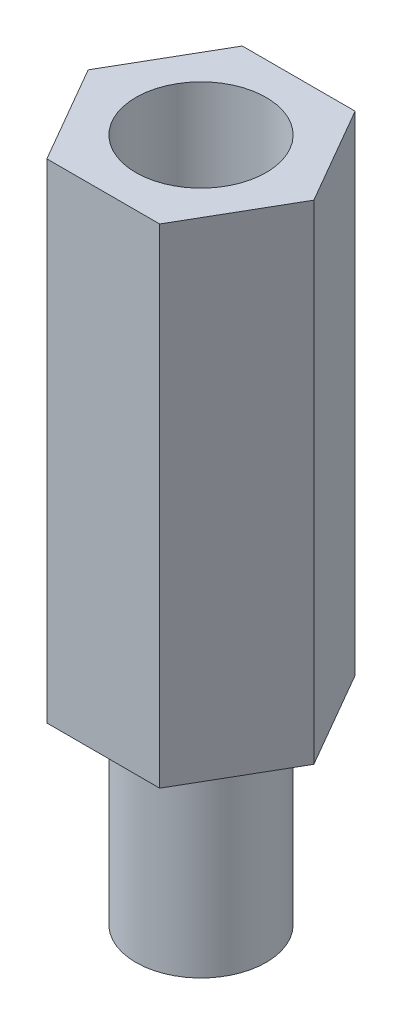
ISO-10303-21;
HEADER;
FILE_DESCRIPTION(('STEP AP214'),'2;1');
FILE_NAME('part.step','',(''),(''),'','','');
FILE_SCHEMA(('AUTOMOTIVE_DESIGN { 1 0 10303 214 1 1 1 1 }'));
ENDSEC;
DATA;
#1=APPLICATION_CONTEXT('core data for automotive mechanical design processes');
#2=APPLICATION_PROTOCOL_DEFINITION('international standard','automotive_design',2000,#1);
#3=PRODUCT_CONTEXT('',#1,'mechanical');
#4=PRODUCT('Part','Part','',(#3));
#5=PRODUCT_RELATED_PRODUCT_CATEGORY('part','',(#4));
#6=PRODUCT_DEFINITION_FORMATION('','',#4);
#7=PRODUCT_DEFINITION_CONTEXT('part definition',#1,'design');
#8=PRODUCT_DEFINITION('design','',#6,#7);
#9=PRODUCT_DEFINITION_SHAPE('','',#8);
#10=(LENGTH_UNIT() NAMED_UNIT(*) SI_UNIT(.MILLI.,.METRE.));
#11=(NAMED_UNIT(*) PLANE_ANGLE_UNIT() SI_UNIT($,.RADIAN.));
#12=(NAMED_UNIT(*) SI_UNIT($,.STERADIAN.) SOLID_ANGLE_UNIT());
#13=UNCERTAINTY_MEASURE_WITH_UNIT(LENGTH_MEASURE(1.E-05),#10,'distance_accuracy_value','');
#14=(GEOMETRIC_REPRESENTATION_CONTEXT(3) GLOBAL_UNCERTAINTY_ASSIGNED_CONTEXT((#13)) GLOBAL_UNIT_ASSIGNED_CONTEXT((#10,
#11,#12)) REPRESENTATION_CONTEXT('',''));
#15=CARTESIAN_POINT('',(0.,0.,0.));
#16=DIRECTION('',(0.,0.,1.));
#17=DIRECTION('',(1.,0.,0.));
#18=AXIS2_PLACEMENT_3D('',#15,#16,#17);
#19=CARTESIAN_POINT('',(0.,-6.,0.));
#20=DIRECTION('',(0.,1.,0.));
#21=DIRECTION('',(0.,0.,1.));
#22=AXIS2_PLACEMENT_3D('',#19,#20,#21);
#23=CYLINDRICAL_SURFACE('',#22,2.);
#24=CARTESIAN_POINT('',(0.,-6.,0.));
#25=DIRECTION('',(0.,1.,0.));
#26=DIRECTION('',(0.,0.,1.));
#27=AXIS2_PLACEMENT_3D('',#24,#25,#26);
#28=CIRCLE('',#27,2.);
#29=CARTESIAN_POINT('',(0.,-6.,2.));
#30=VERTEX_POINT('',#29);
#31=EDGE_CURVE('E11',#30,#30,#28,.T.);
#32=ORIENTED_EDGE('',*,*,#31,.T.);
#33=EDGE_LOOP('',(#32));
#34=FACE_BOUND('',#33,.T.);
#35=CARTESIAN_POINT('',(0.,0.,0.));
#36=DIRECTION('',(0.,1.,0.));
#37=DIRECTION('',(0.,0.,1.));
#38=AXIS2_PLACEMENT_3D('',#35,#36,#37);
#39=CIRCLE('',#38,2.);
#40=CARTESIAN_POINT('',(0.,0.,2.));
#41=VERTEX_POINT('',#40);
#42=EDGE_CURVE('E50',#41,#41,#39,.T.);
#43=ORIENTED_EDGE('',*,*,#42,.F.);
#44=EDGE_LOOP('',(#43));
#45=FACE_BOUND('',#44,.T.);
#46=ADVANCED_FACE('F47',(#34,#45),#23,.T.);
#47=CARTESIAN_POINT('',(0.,-6.,0.));
#48=DIRECTION('',(0.,1.,0.));
#49=DIRECTION('',(0.,0.,1.));
#50=AXIS2_PLACEMENT_3D('',#47,#48,#49);
#51=PLANE('',#50);
#52=ORIENTED_EDGE('',*,*,#31,.F.);
#53=EDGE_LOOP('',(#52));
#54=FACE_BOUND('',#53,.T.);
#55=ADVANCED_FACE('F62',(#54),#51,.F.);
#56=CARTESIAN_POINT('',(0.,0.,0.));
#57=DIRECTION('',(0.,1.,0.));
#58=DIRECTION('',(0.,0.,1.));
#59=AXIS2_PLACEMENT_3D('',#56,#57,#58);
#60=PLANE('',#59);
#61=ORIENTED_EDGE('',*,*,#42,.T.);
#62=EDGE_LOOP('',(#61));
#63=FACE_BOUND('',#62,.T.);
#64=ADVANCED_FACE('F59',(#63),#60,.T.);
#65=CLOSED_SHELL('',(#46,#55,#64));
#66=MANIFOLD_SOLID_BREP('B2',#65);
#67=CARTESIAN_POINT('',(0.,15.,0.));
#68=DIRECTION('',(0.,1.,0.));
#69=DIRECTION('',(0.,0.,1.));
#70=AXIS2_PLACEMENT_3D('',#67,#68,#69);
#71=PLANE('',#70);
#72=DIRECTION('',(0.5,0.,-0.866025403784439));
#73=VECTOR('',#72,1.);
#74=CARTESIAN_POINT('',(1.73205080756889,15.,3.));
#75=LINE('',#74,#73);
#76=CARTESIAN_POINT('',(1.73205080756889,15.,3.));
#77=VERTEX_POINT('',#76);
#78=CARTESIAN_POINT('',(3.46410161513776,15.,0.));
#79=VERTEX_POINT('',#78);
#80=EDGE_CURVE('E195',#77,#79,#75,.T.);
#81=ORIENTED_EDGE('',*,*,#80,.T.);
#82=DIRECTION('',(-0.499999999999999,0.,-0.866025403784439));
#83=VECTOR('',#82,1.);
#84=CARTESIAN_POINT('',(3.46410161513776,15.,0.));
#85=LINE('',#84,#83);
#86=CARTESIAN_POINT('',(1.73205080756888,15.,-3.));
#87=VERTEX_POINT('',#86);
#88=EDGE_CURVE('E143',#79,#87,#85,.T.);
#89=ORIENTED_EDGE('',*,*,#88,.T.);
#90=DIRECTION('',(-1.,0.,0.));
#91=VECTOR('',#90,1.);
#92=CARTESIAN_POINT('',(1.73205080756888,15.,-3.));
#93=LINE('',#92,#91);
#94=CARTESIAN_POINT('',(-1.73205080756888,15.,-3.));
#95=VERTEX_POINT('',#94);
#96=EDGE_CURVE('E156',#87,#95,#93,.T.);
#97=ORIENTED_EDGE('',*,*,#96,.T.);
#98=DIRECTION('',(-0.500000000000001,0.,0.866025403784438));
#99=VECTOR('',#98,1.);
#100=CARTESIAN_POINT('',(-1.73205080756888,15.,-3.));
#101=LINE('',#100,#99);
#102=CARTESIAN_POINT('',(-3.46410161513776,15.,0.));
#103=VERTEX_POINT('',#102);
#104=EDGE_CURVE('E150',#95,#103,#101,.T.);
#105=ORIENTED_EDGE('',*,*,#104,.T.);
#106=DIRECTION('',(0.5,0.,0.866025403784439));
#107=VECTOR('',#106,1.);
#108=CARTESIAN_POINT('',(-3.46410161513776,15.,0.));
#109=LINE('',#108,#107);
#110=CARTESIAN_POINT('',(-1.73205080756888,15.,3.));
#111=VERTEX_POINT('',#110);
#112=EDGE_CURVE('E154',#103,#111,#109,.T.);
#113=ORIENTED_EDGE('',*,*,#112,.T.);
#114=DIRECTION('',(1.,0.,0.));
#115=VECTOR('',#114,1.);
#116=CARTESIAN_POINT('',(-1.73205080756888,15.,3.));
#117=LINE('',#116,#115);
#118=EDGE_CURVE('E106',#111,#77,#117,.T.);
#119=ORIENTED_EDGE('',*,*,#118,.T.);
#120=EDGE_LOOP('',(#81,#89,#97,#105,#113,#119));
#121=FACE_BOUND('',#120,.T.);
#122=CARTESIAN_POINT('',(0.,15.,0.));
#123=DIRECTION('',(0.,1.,0.));
#124=DIRECTION('',(0.,0.,1.));
#125=AXIS2_PLACEMENT_3D('',#122,#123,#124);
#126=CIRCLE('',#125,2.);
#127=CARTESIAN_POINT('',(0.,15.,2.));
#128=VERTEX_POINT('',#127);
#129=EDGE_CURVE('E183',#128,#128,#126,.T.);
#130=ORIENTED_EDGE('',*,*,#129,.F.);
#131=EDGE_LOOP('',(#130));
#132=FACE_BOUND('',#131,.T.);
#133=ADVANCED_FACE('F88',(#121,#132),#71,.T.);
#134=CARTESIAN_POINT('',(0.,0.,0.));
#135=DIRECTION('',(0.,1.,0.));
#136=DIRECTION('',(0.,0.,1.));
#137=AXIS2_PLACEMENT_3D('',#134,#135,#136);
#138=PLANE('',#137);
#139=DIRECTION('',(0.5,0.,-0.866025403784439));
#140=VECTOR('',#139,1.);
#141=CARTESIAN_POINT('',(1.73205080756889,0.,3.));
#142=LINE('',#141,#140);
#143=CARTESIAN_POINT('',(1.73205080756889,0.,3.));
#144=VERTEX_POINT('',#143);
#145=CARTESIAN_POINT('',(3.46410161513776,0.,0.));
#146=VERTEX_POINT('',#145);
#147=EDGE_CURVE('E178',#144,#146,#142,.T.);
#148=ORIENTED_EDGE('',*,*,#147,.F.);
#149=DIRECTION('',(1.,0.,0.));
#150=VECTOR('',#149,1.);
#151=CARTESIAN_POINT('',(-1.73205080756888,0.,3.));
#152=LINE('',#151,#150);
#153=CARTESIAN_POINT('',(-1.73205080756888,0.,3.));
#154=VERTEX_POINT('',#153);
#155=EDGE_CURVE('E135',#154,#144,#152,.T.);
#156=ORIENTED_EDGE('',*,*,#155,.F.);
#157=DIRECTION('',(0.5,0.,0.866025403784439));
#158=VECTOR('',#157,1.);
#159=CARTESIAN_POINT('',(-3.46410161513776,0.,0.));
#160=LINE('',#159,#158);
#161=CARTESIAN_POINT('',(-3.46410161513776,0.,0.));
#162=VERTEX_POINT('',#161);
#163=EDGE_CURVE('E129',#162,#154,#160,.T.);
#164=ORIENTED_EDGE('',*,*,#163,.F.);
#165=DIRECTION('',(-0.500000000000001,0.,0.866025403784438));
#166=VECTOR('',#165,1.);
#167=CARTESIAN_POINT('',(-1.73205080756888,0.,-3.));
#168=LINE('',#167,#166);
#169=CARTESIAN_POINT('',(-1.73205080756888,0.,-3.));
#170=VERTEX_POINT('',#169);
#171=EDGE_CURVE('E165',#170,#162,#168,.T.);
#172=ORIENTED_EDGE('',*,*,#171,.F.);
#173=DIRECTION('',(-1.,0.,0.));
#174=VECTOR('',#173,1.);
#175=CARTESIAN_POINT('',(1.73205080756888,0.,-3.));
#176=LINE('',#175,#174);
#177=CARTESIAN_POINT('',(1.73205080756888,0.,-3.));
#178=VERTEX_POINT('',#177);
#179=EDGE_CURVE('E186',#178,#170,#176,.T.);
#180=ORIENTED_EDGE('',*,*,#179,.F.);
#181=DIRECTION('',(-0.499999999999999,0.,-0.866025403784439));
#182=VECTOR('',#181,1.);
#183=CARTESIAN_POINT('',(3.46410161513776,0.,0.));
#184=LINE('',#183,#182);
#185=EDGE_CURVE('E182',#146,#178,#184,.T.);
#186=ORIENTED_EDGE('',*,*,#185,.F.);
#187=EDGE_LOOP('',(#148,#156,#164,#172,#180,#186));
#188=FACE_BOUND('',#187,.T.);
#189=CARTESIAN_POINT('',(0.,0.,0.));
#190=DIRECTION('',(0.,1.,0.));
#191=DIRECTION('',(0.,0.,1.));
#192=AXIS2_PLACEMENT_3D('',#189,#190,#191);
#193=CIRCLE('',#192,2.);
#194=CARTESIAN_POINT('',(0.,0.,2.));
#195=VERTEX_POINT('',#194);
#196=EDGE_CURVE('E292',#195,#195,#193,.T.);
#197=ORIENTED_EDGE('',*,*,#196,.T.);
#198=EDGE_LOOP('',(#197));
#199=FACE_BOUND('',#198,.T.);
#200=ADVANCED_FACE('F208',(#188,#199),#138,.F.);
#201=CARTESIAN_POINT('',(1.73205080756889,15.,3.));
#202=DIRECTION('',(-0.866025403784439,0.,-0.5));
#203=DIRECTION('',(-0.5,0.,0.866025403784439));
#204=AXIS2_PLACEMENT_3D('',#201,#202,#203);
#205=PLANE('',#204);
#206=ORIENTED_EDGE('',*,*,#147,.T.);
#207=DIRECTION('',(0.,-1.,0.));
#208=VECTOR('',#207,1.);
#209=CARTESIAN_POINT('',(3.46410161513776,15.,0.));
#210=LINE('',#209,#208);
#211=EDGE_CURVE('E45',#79,#146,#210,.T.);
#212=ORIENTED_EDGE('',*,*,#211,.F.);
#213=ORIENTED_EDGE('',*,*,#80,.F.);
#214=DIRECTION('',(0.,-1.,0.));
#215=VECTOR('',#214,1.);
#216=CARTESIAN_POINT('',(1.73205080756889,15.,3.));
#217=LINE('',#216,#215);
#218=EDGE_CURVE('E174',#77,#144,#217,.T.);
#219=ORIENTED_EDGE('',*,*,#218,.T.);
#220=EDGE_LOOP('',(#206,#212,#213,#219));
#221=FACE_BOUND('',#220,.T.);
#222=ADVANCED_FACE('F90',(#221),#205,.F.);
#223=CARTESIAN_POINT('',(3.46410161513776,15.,0.));
#224=DIRECTION('',(-0.866025403784439,0.,0.499999999999999));
#225=DIRECTION('',(0.499999999999999,0.,0.866025403784439));
#226=AXIS2_PLACEMENT_3D('',#223,#224,#225);
#227=PLANE('',#226);
#228=ORIENTED_EDGE('',*,*,#185,.T.);
#229=DIRECTION('',(0.,-1.,0.));
#230=VECTOR('',#229,1.);
#231=CARTESIAN_POINT('',(1.73205080756888,15.,-3.));
#232=LINE('',#231,#230);
#233=EDGE_CURVE('E98',#87,#178,#232,.T.);
#234=ORIENTED_EDGE('',*,*,#233,.F.);
#235=ORIENTED_EDGE('',*,*,#88,.F.);
#236=ORIENTED_EDGE('',*,*,#211,.T.);
#237=EDGE_LOOP('',(#228,#234,#235,#236));
#238=FACE_BOUND('',#237,.T.);
#239=ADVANCED_FACE('F233',(#238),#227,.F.);
#240=CARTESIAN_POINT('',(1.73205080756888,15.,-3.));
#241=DIRECTION('',(0.,0.,1.));
#242=DIRECTION('',(1.,0.,0.));
#243=AXIS2_PLACEMENT_3D('',#240,#241,#242);
#244=PLANE('',#243);
#245=ORIENTED_EDGE('',*,*,#179,.T.);
#246=DIRECTION('',(0.,-1.,0.));
#247=VECTOR('',#246,1.);
#248=CARTESIAN_POINT('',(-1.73205080756888,15.,-3.));
#249=LINE('',#248,#247);
#250=EDGE_CURVE('E167',#95,#170,#249,.T.);
#251=ORIENTED_EDGE('',*,*,#250,.F.);
#252=ORIENTED_EDGE('',*,*,#96,.F.);
#253=ORIENTED_EDGE('',*,*,#233,.T.);
#254=EDGE_LOOP('',(#245,#251,#252,#253));
#255=FACE_BOUND('',#254,.T.);
#256=ADVANCED_FACE('F205',(#255),#244,.F.);
#257=CARTESIAN_POINT('',(-1.73205080756888,15.,-3.));
#258=DIRECTION('',(0.866025403784438,0.,0.500000000000001));
#259=DIRECTION('',(0.500000000000001,0.,-0.866025403784438));
#260=AXIS2_PLACEMENT_3D('',#257,#258,#259);
#261=PLANE('',#260);
#262=ORIENTED_EDGE('',*,*,#171,.T.);
#263=DIRECTION('',(0.,-1.,0.));
#264=VECTOR('',#263,1.);
#265=CARTESIAN_POINT('',(-3.46410161513776,15.,0.));
#266=LINE('',#265,#264);
#267=EDGE_CURVE('E162',#103,#162,#266,.T.);
#268=ORIENTED_EDGE('',*,*,#267,.F.);
#269=ORIENTED_EDGE('',*,*,#104,.F.);
#270=ORIENTED_EDGE('',*,*,#250,.T.);
#271=EDGE_LOOP('',(#262,#268,#269,#270));
#272=FACE_BOUND('',#271,.T.);
#273=ADVANCED_FACE('F163',(#272),#261,.F.);
#274=CARTESIAN_POINT('',(-3.46410161513776,15.,0.));
#275=DIRECTION('',(0.866025403784439,0.,-0.5));
#276=DIRECTION('',(-0.5,0.,-0.866025403784439));
#277=AXIS2_PLACEMENT_3D('',#274,#275,#276);
#278=PLANE('',#277);
#279=ORIENTED_EDGE('',*,*,#163,.T.);
#280=DIRECTION('',(0.,-1.,0.));
#281=VECTOR('',#280,1.);
#282=CARTESIAN_POINT('',(-1.73205080756888,15.,3.));
#283=LINE('',#282,#281);
#284=EDGE_CURVE('E168',#111,#154,#283,.T.);
#285=ORIENTED_EDGE('',*,*,#284,.F.);
#286=ORIENTED_EDGE('',*,*,#112,.F.);
#287=ORIENTED_EDGE('',*,*,#267,.T.);
#288=EDGE_LOOP('',(#279,#285,#286,#287));
#289=FACE_BOUND('',#288,.T.);
#290=ADVANCED_FACE('F170',(#289),#278,.F.);
#291=CARTESIAN_POINT('',(-1.73205080756888,15.,3.));
#292=DIRECTION('',(0.,0.,-1.));
#293=DIRECTION('',(-1.,0.,0.));
#294=AXIS2_PLACEMENT_3D('',#291,#292,#293);
#295=PLANE('',#294);
#296=ORIENTED_EDGE('',*,*,#155,.T.);
#297=ORIENTED_EDGE('',*,*,#218,.F.);
#298=ORIENTED_EDGE('',*,*,#118,.F.);
#299=ORIENTED_EDGE('',*,*,#284,.T.);
#300=EDGE_LOOP('',(#296,#297,#298,#299));
#301=FACE_BOUND('',#300,.T.);
#302=ADVANCED_FACE('F213',(#301),#295,.F.);
#303=CARTESIAN_POINT('',(0.,15.,0.));
#304=DIRECTION('',(0.,-1.,0.));
#305=DIRECTION('',(0.,0.,-1.));
#306=AXIS2_PLACEMENT_3D('',#303,#304,#305);
#307=CYLINDRICAL_SURFACE('',#306,2.);
#308=ORIENTED_EDGE('',*,*,#129,.T.);
#309=EDGE_LOOP('',(#308));
#310=FACE_BOUND('',#309,.T.);
#311=ORIENTED_EDGE('',*,*,#196,.F.);
#312=EDGE_LOOP('',(#311));
#313=FACE_BOUND('',#312,.T.);
#314=ADVANCED_FACE('F215',(#310,#313),#307,.F.);
#315=CLOSED_SHELL('',(#133,#200,#222,#239,#256,#273,#290,#302,#314));
#316=MANIFOLD_SOLID_BREP('B6',#315);
#317=ADVANCED_BREP_SHAPE_REPRESENTATION('',(#18,#66,#316),#14);
#318=SHAPE_DEFINITION_REPRESENTATION(#9,#317);
ENDSEC;
END-ISO-10303-21;
